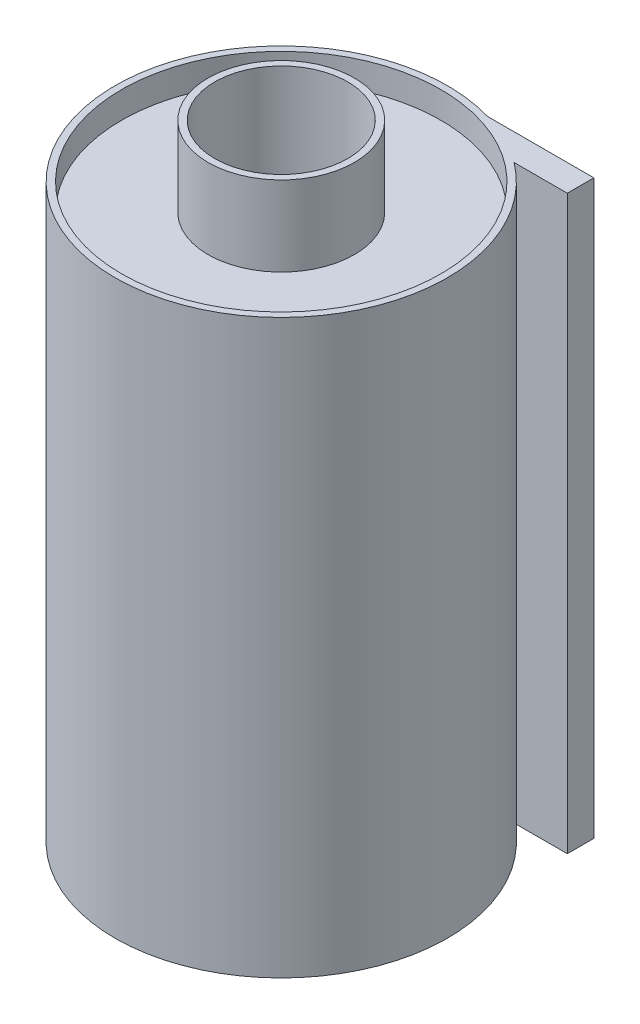
ISO-10303-21;
HEADER;
FILE_DESCRIPTION(('STEP AP214'),'2;1');
FILE_NAME('part.step','',(''),(''),'','','');
FILE_SCHEMA(('AUTOMOTIVE_DESIGN { 1 0 10303 214 1 1 1 1 }'));
ENDSEC;
DATA;
#1=APPLICATION_CONTEXT('core data for automotive mechanical design processes');
#2=APPLICATION_PROTOCOL_DEFINITION('international standard','automotive_design',2000,#1);
#3=PRODUCT_CONTEXT('',#1,'mechanical');
#4=PRODUCT('Part','Part','',(#3));
#5=PRODUCT_RELATED_PRODUCT_CATEGORY('part','',(#4));
#6=PRODUCT_DEFINITION_FORMATION('','',#4);
#7=PRODUCT_DEFINITION_CONTEXT('part definition',#1,'design');
#8=PRODUCT_DEFINITION('design','',#6,#7);
#9=PRODUCT_DEFINITION_SHAPE('','',#8);
#10=(LENGTH_UNIT() NAMED_UNIT(*) SI_UNIT(.MILLI.,.METRE.));
#11=(NAMED_UNIT(*) PLANE_ANGLE_UNIT() SI_UNIT($,.RADIAN.));
#12=(NAMED_UNIT(*) SI_UNIT($,.STERADIAN.) SOLID_ANGLE_UNIT());
#13=UNCERTAINTY_MEASURE_WITH_UNIT(LENGTH_MEASURE(1.E-05),#10,'distance_accuracy_value','');
#14=(GEOMETRIC_REPRESENTATION_CONTEXT(3) GLOBAL_UNCERTAINTY_ASSIGNED_CONTEXT((#13)) GLOBAL_UNIT_ASSIGNED_CONTEXT((#10,
#11,#12)) REPRESENTATION_CONTEXT('',''));
#15=CARTESIAN_POINT('',(0.,0.,0.));
#16=DIRECTION('',(0.,0.,1.));
#17=DIRECTION('',(1.,0.,0.));
#18=AXIS2_PLACEMENT_3D('',#15,#16,#17);
#19=CARTESIAN_POINT('',(0.,2.,0.));
#20=DIRECTION('',(0.,-1.,0.));
#21=DIRECTION('',(0.,0.,-1.));
#22=AXIS2_PLACEMENT_3D('',#19,#20,#21);
#23=PLANE('',#22);
#24=CARTESIAN_POINT('',(0.,2.,0.));
#25=DIRECTION('',(0.,-1.,0.));
#26=DIRECTION('',(0.,0.,-1.));
#27=AXIS2_PLACEMENT_3D('',#24,#25,#26);
#28=CIRCLE('',#27,12.);
#29=CARTESIAN_POINT('',(0.,2.,-12.));
#30=VERTEX_POINT('',#29);
#31=EDGE_CURVE('E109',#30,#30,#28,.T.);
#32=ORIENTED_EDGE('',*,*,#31,.T.);
#33=EDGE_LOOP('',(#32));
#34=FACE_BOUND('',#33,.T.);
#35=CARTESIAN_POINT('',(0.,2.,0.));
#36=DIRECTION('',(0.,-1.,0.));
#37=DIRECTION('',(0.,0.,-1.));
#38=AXIS2_PLACEMENT_3D('',#35,#36,#37);
#39=CIRCLE('',#38,5.5);
#40=CARTESIAN_POINT('',(0.,2.,-5.5));
#41=VERTEX_POINT('',#40);
#42=EDGE_CURVE('E116',#41,#41,#39,.T.);
#43=ORIENTED_EDGE('',*,*,#42,.F.);
#44=EDGE_LOOP('',(#43));
#45=FACE_BOUND('',#44,.T.);
#46=ADVANCED_FACE('F34',(#34,#45),#23,.T.);
#47=CARTESIAN_POINT('',(0.,0.,0.));
#48=DIRECTION('',(0.,1.,0.));
#49=DIRECTION('',(0.,0.,1.));
#50=AXIS2_PLACEMENT_3D('',#47,#48,#49);
#51=CYLINDRICAL_SURFACE('',#50,5.);
#52=CARTESIAN_POINT('',(0.,47.,0.));
#53=DIRECTION('',(0.,1.,0.));
#54=DIRECTION('',(0.,0.,1.));
#55=AXIS2_PLACEMENT_3D('',#52,#53,#54);
#56=CIRCLE('',#55,5.);
#57=CARTESIAN_POINT('',(0.,47.,5.));
#58=VERTEX_POINT('',#57);
#59=EDGE_CURVE('E104',#58,#58,#56,.T.);
#60=ORIENTED_EDGE('',*,*,#59,.T.);
#61=EDGE_LOOP('',(#60));
#62=FACE_BOUND('',#61,.T.);
#63=CARTESIAN_POINT('',(0.,1.,0.));
#64=DIRECTION('',(0.,-1.,0.));
#65=DIRECTION('',(0.,0.,-1.));
#66=AXIS2_PLACEMENT_3D('',#63,#64,#65);
#67=CIRCLE('',#66,5.);
#68=CARTESIAN_POINT('',(0.,1.,-5.));
#69=VERTEX_POINT('',#68);
#70=EDGE_CURVE('E119',#69,#69,#67,.T.);
#71=ORIENTED_EDGE('',*,*,#70,.T.);
#72=EDGE_LOOP('',(#71));
#73=FACE_BOUND('',#72,.T.);
#74=ADVANCED_FACE('F153',(#62,#73),#51,.F.);
#75=CARTESIAN_POINT('',(0.,41.,0.));
#76=DIRECTION('',(0.,-1.,0.));
#77=DIRECTION('',(0.,0.,-1.));
#78=AXIS2_PLACEMENT_3D('',#75,#76,#77);
#79=CYLINDRICAL_SURFACE('',#78,12.5);
#80=CARTESIAN_POINT('',(0.,43.,0.));
#81=DIRECTION('',(0.,1.,0.));
#82=DIRECTION('',(0.,0.,1.));
#83=AXIS2_PLACEMENT_3D('',#80,#81,#82);
#84=CIRCLE('',#83,12.5);
#85=CARTESIAN_POINT('',(3.50000000000005,43.,-12.));
#86=VERTEX_POINT('',#85);
#87=CARTESIAN_POINT('',(7.50000000000002,43.,-10.));
#88=VERTEX_POINT('',#87);
#89=EDGE_CURVE('E91',#86,#88,#84,.T.);
#90=ORIENTED_EDGE('',*,*,#89,.F.);
#91=DIRECTION('',(0.,1.,0.));
#92=VECTOR('',#91,1.);
#93=CARTESIAN_POINT('',(3.50000000000005,-8.24621125123529,-12.));
#94=LINE('',#93,#92);
#95=CARTESIAN_POINT('',(3.50000000000005,0.,-12.));
#96=VERTEX_POINT('',#95);
#97=EDGE_CURVE('E129',#96,#86,#94,.T.);
#98=ORIENTED_EDGE('',*,*,#97,.F.);
#99=CARTESIAN_POINT('',(0.,0.,0.));
#100=DIRECTION('',(0.,1.,0.));
#101=DIRECTION('',(0.,0.,1.));
#102=AXIS2_PLACEMENT_3D('',#99,#100,#101);
#103=CIRCLE('',#102,12.5);
#104=CARTESIAN_POINT('',(7.50000000000002,0.,-10.));
#105=VERTEX_POINT('',#104);
#106=EDGE_CURVE('E42',#96,#105,#103,.T.);
#107=ORIENTED_EDGE('',*,*,#106,.T.);
#108=DIRECTION('',(0.,1.,0.));
#109=VECTOR('',#108,1.);
#110=CARTESIAN_POINT('',(7.50000000000002,-8.24621125123529,-10.));
#111=LINE('',#110,#109);
#112=EDGE_CURVE('E81',#105,#88,#111,.T.);
#113=ORIENTED_EDGE('',*,*,#112,.T.);
#114=EDGE_LOOP('',(#90,#98,#107,#113));
#115=FACE_BOUND('',#114,.T.);
#116=ADVANCED_FACE('F36',(#115),#79,.T.);
#117=CARTESIAN_POINT('',(0.,0.,0.));
#118=DIRECTION('',(0.,1.,0.));
#119=DIRECTION('',(0.,0.,1.));
#120=AXIS2_PLACEMENT_3D('',#117,#118,#119);
#121=PLANE('',#120);
#122=CARTESIAN_POINT('',(0.,0.,0.));
#123=DIRECTION('',(0.,-1.,0.));
#124=DIRECTION('',(0.,0.,-1.));
#125=AXIS2_PLACEMENT_3D('',#122,#123,#124);
#126=CIRCLE('',#125,12.);
#127=CARTESIAN_POINT('',(0.,0.,-12.));
#128=VERTEX_POINT('',#127);
#129=EDGE_CURVE('E110',#128,#128,#126,.T.);
#130=ORIENTED_EDGE('',*,*,#129,.F.);
#131=EDGE_LOOP('',(#130));
#132=FACE_BOUND('',#131,.T.);
#133=ORIENTED_EDGE('',*,*,#106,.F.);
#134=DIRECTION('',(1.,0.,0.));
#135=VECTOR('',#134,1.);
#136=CARTESIAN_POINT('',(3.50000000000005,0.,-12.));
#137=LINE('',#136,#135);
#138=CARTESIAN_POINT('',(11.5,0.,-12.));
#139=VERTEX_POINT('',#138);
#140=EDGE_CURVE('E58',#96,#139,#137,.T.);
#141=ORIENTED_EDGE('',*,*,#140,.T.);
#142=DIRECTION('',(0.,0.,1.));
#143=VECTOR('',#142,1.);
#144=CARTESIAN_POINT('',(11.5,0.,-12.));
#145=LINE('',#144,#143);
#146=CARTESIAN_POINT('',(11.5,0.,-10.));
#147=VERTEX_POINT('',#146);
#148=EDGE_CURVE('E131',#139,#147,#145,.T.);
#149=ORIENTED_EDGE('',*,*,#148,.T.);
#150=DIRECTION('',(-1.,0.,0.));
#151=VECTOR('',#150,1.);
#152=CARTESIAN_POINT('',(11.5,0.,-10.));
#153=LINE('',#152,#151);
#154=EDGE_CURVE('E124',#147,#105,#153,.T.);
#155=ORIENTED_EDGE('',*,*,#154,.T.);
#156=EDGE_LOOP('',(#133,#141,#149,#155));
#157=FACE_BOUND('',#156,.T.);
#158=ADVANCED_FACE('F135',(#132,#157),#121,.F.);
#159=CARTESIAN_POINT('',(0.,43.,0.));
#160=DIRECTION('',(0.,1.,0.));
#161=DIRECTION('',(0.,0.,1.));
#162=AXIS2_PLACEMENT_3D('',#159,#160,#161);
#163=PLANE('',#162);
#164=ORIENTED_EDGE('',*,*,#89,.T.);
#165=DIRECTION('',(1.,0.,0.));
#166=VECTOR('',#165,1.);
#167=CARTESIAN_POINT('',(11.5,43.,-10.));
#168=LINE('',#167,#166);
#169=CARTESIAN_POINT('',(11.5,43.,-10.));
#170=VERTEX_POINT('',#169);
#171=EDGE_CURVE('E77',#88,#170,#168,.T.);
#172=ORIENTED_EDGE('',*,*,#171,.T.);
#173=DIRECTION('',(0.,0.,-1.));
#174=VECTOR('',#173,1.);
#175=CARTESIAN_POINT('',(11.5,43.,-12.));
#176=LINE('',#175,#174);
#177=CARTESIAN_POINT('',(11.5,43.,-12.));
#178=VERTEX_POINT('',#177);
#179=EDGE_CURVE('E86',#170,#178,#176,.T.);
#180=ORIENTED_EDGE('',*,*,#179,.T.);
#181=DIRECTION('',(-1.,0.,0.));
#182=VECTOR('',#181,1.);
#183=CARTESIAN_POINT('',(3.50000000000005,43.,-12.));
#184=LINE('',#183,#182);
#185=EDGE_CURVE('E49',#178,#86,#184,.T.);
#186=ORIENTED_EDGE('',*,*,#185,.T.);
#187=EDGE_LOOP('',(#164,#172,#180,#186));
#188=FACE_BOUND('',#187,.T.);
#189=CARTESIAN_POINT('',(0.,43.,0.));
#190=DIRECTION('',(0.,1.,0.));
#191=DIRECTION('',(0.,0.,1.));
#192=AXIS2_PLACEMENT_3D('',#189,#190,#191);
#193=CIRCLE('',#192,12.);
#194=CARTESIAN_POINT('',(0.,43.,12.));
#195=VERTEX_POINT('',#194);
#196=EDGE_CURVE('E95',#195,#195,#193,.T.);
#197=ORIENTED_EDGE('',*,*,#196,.F.);
#198=EDGE_LOOP('',(#197));
#199=FACE_BOUND('',#198,.T.);
#200=ADVANCED_FACE('F93',(#188,#199),#163,.T.);
#201=CARTESIAN_POINT('',(0.,43.,0.));
#202=DIRECTION('',(0.,-1.,0.));
#203=DIRECTION('',(0.,0.,-1.));
#204=AXIS2_PLACEMENT_3D('',#201,#202,#203);
#205=CYLINDRICAL_SURFACE('',#204,12.);
#206=ORIENTED_EDGE('',*,*,#196,.T.);
#207=EDGE_LOOP('',(#206));
#208=FACE_BOUND('',#207,.T.);
#209=CARTESIAN_POINT('',(0.,41.,0.));
#210=DIRECTION('',(0.,1.,0.));
#211=DIRECTION('',(0.,0.,1.));
#212=AXIS2_PLACEMENT_3D('',#209,#210,#211);
#213=CIRCLE('',#212,12.);
#214=CARTESIAN_POINT('',(0.,41.,12.));
#215=VERTEX_POINT('',#214);
#216=EDGE_CURVE('E11',#215,#215,#213,.F.);
#217=ORIENTED_EDGE('',*,*,#216,.T.);
#218=EDGE_LOOP('',(#217));
#219=FACE_BOUND('',#218,.T.);
#220=ADVANCED_FACE('F177',(#208,#219),#205,.F.);
#221=CARTESIAN_POINT('',(0.,41.,0.));
#222=DIRECTION('',(0.,1.,0.));
#223=DIRECTION('',(0.,0.,1.));
#224=AXIS2_PLACEMENT_3D('',#221,#222,#223);
#225=PLANE('',#224);
#226=CARTESIAN_POINT('',(0.,41.,0.));
#227=DIRECTION('',(0.,1.,0.));
#228=DIRECTION('',(0.,0.,1.));
#229=AXIS2_PLACEMENT_3D('',#226,#227,#228);
#230=CIRCLE('',#229,5.5);
#231=CARTESIAN_POINT('',(0.,41.,5.5));
#232=VERTEX_POINT('',#231);
#233=EDGE_CURVE('E101',#232,#232,#230,.T.);
#234=ORIENTED_EDGE('',*,*,#233,.F.);
#235=EDGE_LOOP('',(#234));
#236=FACE_BOUND('',#235,.T.);
#237=ORIENTED_EDGE('',*,*,#216,.F.);
#238=EDGE_LOOP('',(#237));
#239=FACE_BOUND('',#238,.T.);
#240=ADVANCED_FACE('F175',(#236,#239),#225,.T.);
#241=CARTESIAN_POINT('',(0.,47.,0.));
#242=DIRECTION('',(0.,-1.,0.));
#243=DIRECTION('',(0.,0.,-1.));
#244=AXIS2_PLACEMENT_3D('',#241,#242,#243);
#245=CYLINDRICAL_SURFACE('',#244,5.5);
#246=CARTESIAN_POINT('',(0.,47.,0.));
#247=DIRECTION('',(0.,1.,0.));
#248=DIRECTION('',(0.,0.,1.));
#249=AXIS2_PLACEMENT_3D('',#246,#247,#248);
#250=CIRCLE('',#249,5.5);
#251=CARTESIAN_POINT('',(0.,47.,5.5));
#252=VERTEX_POINT('',#251);
#253=EDGE_CURVE('E98',#252,#252,#250,.T.);
#254=ORIENTED_EDGE('',*,*,#253,.F.);
#255=EDGE_LOOP('',(#254));
#256=FACE_BOUND('',#255,.T.);
#257=ORIENTED_EDGE('',*,*,#233,.T.);
#258=EDGE_LOOP('',(#257));
#259=FACE_BOUND('',#258,.T.);
#260=ADVANCED_FACE('F171',(#256,#259),#245,.T.);
#261=CARTESIAN_POINT('',(0.,47.,0.));
#262=DIRECTION('',(0.,1.,0.));
#263=DIRECTION('',(0.,0.,1.));
#264=AXIS2_PLACEMENT_3D('',#261,#262,#263);
#265=PLANE('',#264);
#266=ORIENTED_EDGE('',*,*,#59,.F.);
#267=EDGE_LOOP('',(#266));
#268=FACE_BOUND('',#267,.T.);
#269=ORIENTED_EDGE('',*,*,#253,.T.);
#270=EDGE_LOOP('',(#269));
#271=FACE_BOUND('',#270,.T.);
#272=ADVANCED_FACE('F166',(#268,#271),#265,.T.);
#273=CARTESIAN_POINT('',(0.,2.,0.));
#274=DIRECTION('',(0.,-1.,0.));
#275=DIRECTION('',(0.,0.,-1.));
#276=AXIS2_PLACEMENT_3D('',#273,#274,#275);
#277=CYLINDRICAL_SURFACE('',#276,12.);
#278=ORIENTED_EDGE('',*,*,#31,.F.);
#279=EDGE_LOOP('',(#278));
#280=FACE_BOUND('',#279,.T.);
#281=ORIENTED_EDGE('',*,*,#129,.T.);
#282=EDGE_LOOP('',(#281));
#283=FACE_BOUND('',#282,.T.);
#284=ADVANCED_FACE('F164',(#280,#283),#277,.F.);
#285=CARTESIAN_POINT('',(0.,1.,0.));
#286=DIRECTION('',(0.,-1.,0.));
#287=DIRECTION('',(0.,0.,-1.));
#288=AXIS2_PLACEMENT_3D('',#285,#286,#287);
#289=PLANE('',#288);
#290=CARTESIAN_POINT('',(0.,1.,0.));
#291=DIRECTION('',(0.,-1.,0.));
#292=DIRECTION('',(0.,0.,-1.));
#293=AXIS2_PLACEMENT_3D('',#290,#291,#292);
#294=CIRCLE('',#293,5.5);
#295=CARTESIAN_POINT('',(0.,1.,-5.5));
#296=VERTEX_POINT('',#295);
#297=EDGE_CURVE('E113',#296,#296,#294,.T.);
#298=ORIENTED_EDGE('',*,*,#297,.T.);
#299=EDGE_LOOP('',(#298));
#300=FACE_BOUND('',#299,.T.);
#301=ORIENTED_EDGE('',*,*,#70,.F.);
#302=EDGE_LOOP('',(#301));
#303=FACE_BOUND('',#302,.T.);
#304=ADVANCED_FACE('F149',(#300,#303),#289,.T.);
#305=CARTESIAN_POINT('',(0.,1.,0.));
#306=DIRECTION('',(0.,1.,0.));
#307=DIRECTION('',(0.,0.,1.));
#308=AXIS2_PLACEMENT_3D('',#305,#306,#307);
#309=CYLINDRICAL_SURFACE('',#308,5.5);
#310=ORIENTED_EDGE('',*,*,#297,.F.);
#311=EDGE_LOOP('',(#310));
#312=FACE_BOUND('',#311,.T.);
#313=ORIENTED_EDGE('',*,*,#42,.T.);
#314=EDGE_LOOP('',(#313));
#315=FACE_BOUND('',#314,.T.);
#316=ADVANCED_FACE('F142',(#312,#315),#309,.T.);
#317=CARTESIAN_POINT('',(3.50000000000005,-8.24621125123529,-12.));
#318=DIRECTION('',(0.,0.,-1.));
#319=DIRECTION('',(-1.,0.,0.));
#320=AXIS2_PLACEMENT_3D('',#317,#318,#319);
#321=PLANE('',#320);
#322=ORIENTED_EDGE('',*,*,#140,.F.);
#323=ORIENTED_EDGE('',*,*,#97,.T.);
#324=ORIENTED_EDGE('',*,*,#185,.F.);
#325=DIRECTION('',(0.,1.,0.));
#326=VECTOR('',#325,1.);
#327=CARTESIAN_POINT('',(11.5,-8.24621125123529,-12.));
#328=LINE('',#327,#326);
#329=EDGE_CURVE('E127',#139,#178,#328,.T.);
#330=ORIENTED_EDGE('',*,*,#329,.F.);
#331=EDGE_LOOP('',(#322,#323,#324,#330));
#332=FACE_BOUND('',#331,.T.);
#333=ADVANCED_FACE('F140',(#332),#321,.T.);
#334=CARTESIAN_POINT('',(11.5,-8.24621125123529,-12.));
#335=DIRECTION('',(1.,0.,0.));
#336=DIRECTION('',(0.,0.,-1.));
#337=AXIS2_PLACEMENT_3D('',#334,#335,#336);
#338=PLANE('',#337);
#339=ORIENTED_EDGE('',*,*,#148,.F.);
#340=ORIENTED_EDGE('',*,*,#329,.T.);
#341=ORIENTED_EDGE('',*,*,#179,.F.);
#342=DIRECTION('',(0.,1.,0.));
#343=VECTOR('',#342,1.);
#344=CARTESIAN_POINT('',(11.5,-8.24621125123529,-10.));
#345=LINE('',#344,#343);
#346=EDGE_CURVE('E84',#147,#170,#345,.T.);
#347=ORIENTED_EDGE('',*,*,#346,.F.);
#348=EDGE_LOOP('',(#339,#340,#341,#347));
#349=FACE_BOUND('',#348,.T.);
#350=ADVANCED_FACE('F138',(#349),#338,.T.);
#351=CARTESIAN_POINT('',(11.5,-8.24621125123529,-10.));
#352=DIRECTION('',(0.,0.,1.));
#353=DIRECTION('',(1.,0.,0.));
#354=AXIS2_PLACEMENT_3D('',#351,#352,#353);
#355=PLANE('',#354);
#356=ORIENTED_EDGE('',*,*,#154,.F.);
#357=ORIENTED_EDGE('',*,*,#346,.T.);
#358=ORIENTED_EDGE('',*,*,#171,.F.);
#359=ORIENTED_EDGE('',*,*,#112,.F.);
#360=EDGE_LOOP('',(#356,#357,#358,#359));
#361=FACE_BOUND('',#360,.T.);
#362=ADVANCED_FACE('F80',(#361),#355,.T.);
#363=CLOSED_SHELL('',(#46,#74,#116,#158,#200,#220,#240,#260,#272,#284,#304,#316,#333,#350,#362));
#364=MANIFOLD_SOLID_BREP('B2',#363);
#365=ADVANCED_BREP_SHAPE_REPRESENTATION('',(#18,#364),#14);
#366=SHAPE_DEFINITION_REPRESENTATION(#9,#365);
ENDSEC;
END-ISO-10303-21;
